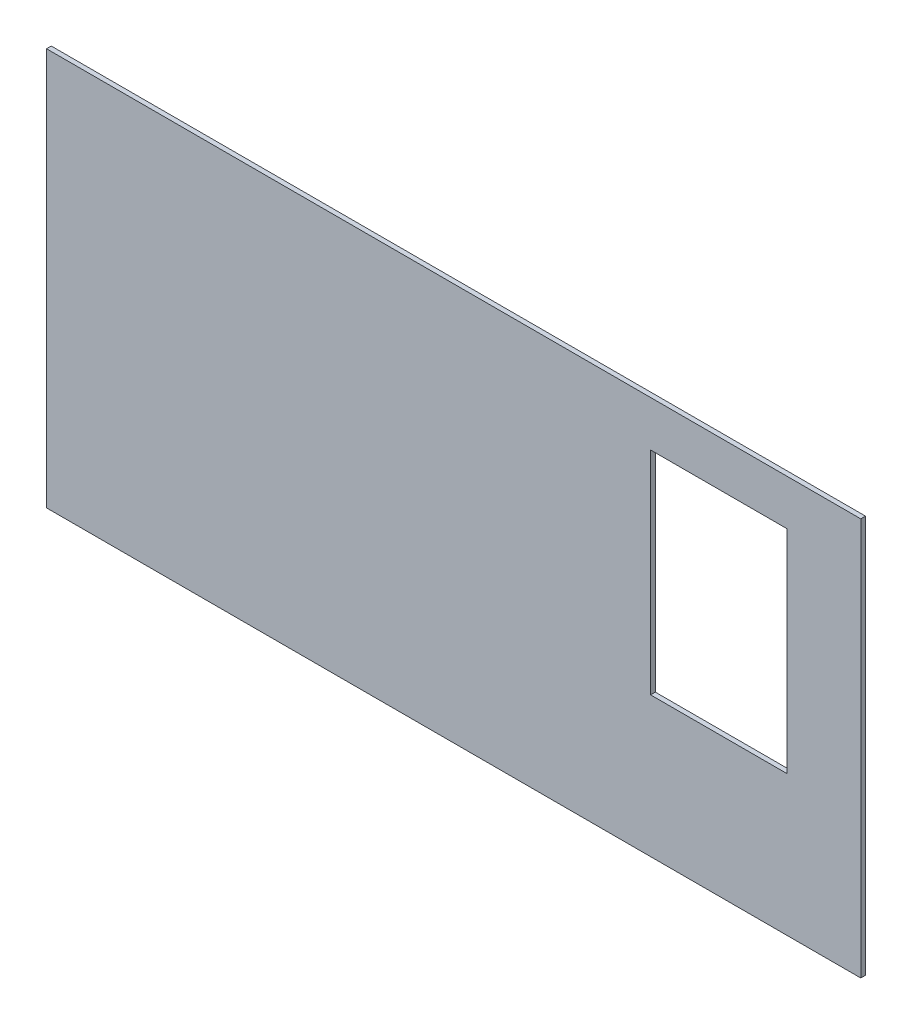
ISO-10303-21;
HEADER;
FILE_DESCRIPTION(('STEP AP214'),'2;1');
FILE_NAME('part.step','',(''),(''),'','','');
FILE_SCHEMA(('AUTOMOTIVE_DESIGN { 1 0 10303 214 1 1 1 1 }'));
ENDSEC;
DATA;
#1=APPLICATION_CONTEXT('core data for automotive mechanical design processes');
#2=APPLICATION_PROTOCOL_DEFINITION('international standard','automotive_design',2000,#1);
#3=PRODUCT_CONTEXT('',#1,'mechanical');
#4=PRODUCT('Part','Part','',(#3));
#5=PRODUCT_RELATED_PRODUCT_CATEGORY('part','',(#4));
#6=PRODUCT_DEFINITION_FORMATION('','',#4);
#7=PRODUCT_DEFINITION_CONTEXT('part definition',#1,'design');
#8=PRODUCT_DEFINITION('design','',#6,#7);
#9=PRODUCT_DEFINITION_SHAPE('','',#8);
#10=(LENGTH_UNIT() NAMED_UNIT(*) SI_UNIT(.MILLI.,.METRE.));
#11=(NAMED_UNIT(*) PLANE_ANGLE_UNIT() SI_UNIT($,.RADIAN.));
#12=(NAMED_UNIT(*) SI_UNIT($,.STERADIAN.) SOLID_ANGLE_UNIT());
#13=UNCERTAINTY_MEASURE_WITH_UNIT(LENGTH_MEASURE(1.E-05),#10,'distance_accuracy_value','');
#14=(GEOMETRIC_REPRESENTATION_CONTEXT(3) GLOBAL_UNCERTAINTY_ASSIGNED_CONTEXT((#13)) GLOBAL_UNIT_ASSIGNED_CONTEXT((#10,
#11,#12)) REPRESENTATION_CONTEXT('',''));
#15=CARTESIAN_POINT('',(0.,0.,0.));
#16=DIRECTION('',(0.,0.,1.));
#17=DIRECTION('',(1.,0.,0.));
#18=AXIS2_PLACEMENT_3D('',#15,#16,#17);
#19=CARTESIAN_POINT('',(208.,-62.,-5.1));
#20=DIRECTION('',(1.,0.,0.));
#21=DIRECTION('',(0.,1.,0.));
#22=AXIS2_PLACEMENT_3D('',#19,#20,#21);
#23=PLANE('',#22);
#24=DIRECTION('',(0.,0.,1.));
#25=VECTOR('',#24,1.);
#26=CARTESIAN_POINT('',(208.,-62.,-5.1));
#27=LINE('',#26,#25);
#28=CARTESIAN_POINT('',(208.,-62.,-5.));
#29=VERTEX_POINT('',#28);
#30=CARTESIAN_POINT('',(208.,-62.,0.));
#31=VERTEX_POINT('',#30);
#32=EDGE_CURVE('E40',#29,#31,#27,.T.);
#33=ORIENTED_EDGE('',*,*,#32,.F.);
#34=DIRECTION('',(0.,1.,0.));
#35=VECTOR('',#34,1.);
#36=CARTESIAN_POINT('',(208.,-136.,-5.));
#37=LINE('',#36,#35);
#38=CARTESIAN_POINT('',(208.,162.,-5.));
#39=VERTEX_POINT('',#38);
#40=EDGE_CURVE('E95',#29,#39,#37,.T.);
#41=ORIENTED_EDGE('',*,*,#40,.T.);
#42=DIRECTION('',(0.,0.,1.));
#43=VECTOR('',#42,1.);
#44=CARTESIAN_POINT('',(208.,162.,-5.1));
#45=LINE('',#44,#43);
#46=CARTESIAN_POINT('',(208.,162.,0.));
#47=VERTEX_POINT('',#46);
#48=EDGE_CURVE('E9',#39,#47,#45,.T.);
#49=ORIENTED_EDGE('',*,*,#48,.T.);
#50=DIRECTION('',(0.,1.,0.));
#51=VECTOR('',#50,1.);
#52=CARTESIAN_POINT('',(208.,-136.,0.));
#53=LINE('',#52,#51);
#54=EDGE_CURVE('E110',#31,#47,#53,.T.);
#55=ORIENTED_EDGE('',*,*,#54,.F.);
#56=EDGE_LOOP('',(#33,#41,#49,#55));
#57=FACE_BOUND('',#56,.T.);
#58=ADVANCED_FACE('F15',(#57),#23,.T.);
#59=CARTESIAN_POINT('',(208.,162.,-5.1));
#60=DIRECTION('',(0.,1.,0.));
#61=DIRECTION('',(1.,0.,0.));
#62=AXIS2_PLACEMENT_3D('',#59,#60,#61);
#63=PLANE('',#62);
#64=DIRECTION('',(-1.,0.,0.));
#65=VECTOR('',#64,1.);
#66=CARTESIAN_POINT('',(-111.,162.,0.));
#67=LINE('',#66,#65);
#68=CARTESIAN_POINT('',(352.,162.,0.));
#69=VERTEX_POINT('',#68);
#70=EDGE_CURVE('E150',#69,#47,#67,.T.);
#71=ORIENTED_EDGE('',*,*,#70,.T.);
#72=ORIENTED_EDGE('',*,*,#48,.F.);
#73=DIRECTION('',(-1.,0.,0.));
#74=VECTOR('',#73,1.);
#75=CARTESIAN_POINT('',(-111.,162.,-5.));
#76=LINE('',#75,#74);
#77=CARTESIAN_POINT('',(352.,162.,-5.));
#78=VERTEX_POINT('',#77);
#79=EDGE_CURVE('E87',#78,#39,#76,.T.);
#80=ORIENTED_EDGE('',*,*,#79,.F.);
#81=DIRECTION('',(0.,0.,1.));
#82=VECTOR('',#81,1.);
#83=CARTESIAN_POINT('',(352.,162.,-5.1));
#84=LINE('',#83,#82);
#85=EDGE_CURVE('E18',#78,#69,#84,.T.);
#86=ORIENTED_EDGE('',*,*,#85,.T.);
#87=EDGE_LOOP('',(#71,#72,#80,#86));
#88=FACE_BOUND('',#87,.T.);
#89=ADVANCED_FACE('F86',(#88),#63,.F.);
#90=CARTESIAN_POINT('',(352.,-62.,-5.1));
#91=DIRECTION('',(1.,0.,0.));
#92=DIRECTION('',(0.,1.,0.));
#93=AXIS2_PLACEMENT_3D('',#90,#91,#92);
#94=PLANE('',#93);
#95=DIRECTION('',(0.,1.,0.));
#96=VECTOR('',#95,1.);
#97=CARTESIAN_POINT('',(352.,-136.,0.));
#98=LINE('',#97,#96);
#99=CARTESIAN_POINT('',(352.,-62.,0.));
#100=VERTEX_POINT('',#99);
#101=EDGE_CURVE('E81',#100,#69,#98,.T.);
#102=ORIENTED_EDGE('',*,*,#101,.T.);
#103=ORIENTED_EDGE('',*,*,#85,.F.);
#104=DIRECTION('',(0.,1.,0.));
#105=VECTOR('',#104,1.);
#106=CARTESIAN_POINT('',(352.,-136.,-5.));
#107=LINE('',#106,#105);
#108=CARTESIAN_POINT('',(352.,-62.,-5.));
#109=VERTEX_POINT('',#108);
#110=EDGE_CURVE('E78',#109,#78,#107,.T.);
#111=ORIENTED_EDGE('',*,*,#110,.F.);
#112=DIRECTION('',(0.,0.,1.));
#113=VECTOR('',#112,1.);
#114=CARTESIAN_POINT('',(352.,-62.,-5.1));
#115=LINE('',#114,#113);
#116=EDGE_CURVE('E114',#109,#100,#115,.T.);
#117=ORIENTED_EDGE('',*,*,#116,.T.);
#118=EDGE_LOOP('',(#102,#103,#111,#117));
#119=FACE_BOUND('',#118,.T.);
#120=ADVANCED_FACE('F80',(#119),#94,.F.);
#121=CARTESIAN_POINT('',(208.,-62.,-5.1));
#122=DIRECTION('',(0.,1.,0.));
#123=DIRECTION('',(1.,0.,0.));
#124=AXIS2_PLACEMENT_3D('',#121,#122,#123);
#125=PLANE('',#124);
#126=ORIENTED_EDGE('',*,*,#116,.F.);
#127=DIRECTION('',(-1.,0.,0.));
#128=VECTOR('',#127,1.);
#129=CARTESIAN_POINT('',(-111.,-62.,-5.));
#130=LINE('',#129,#128);
#131=EDGE_CURVE('E100',#109,#29,#130,.T.);
#132=ORIENTED_EDGE('',*,*,#131,.T.);
#133=ORIENTED_EDGE('',*,*,#32,.T.);
#134=DIRECTION('',(-1.,0.,0.));
#135=VECTOR('',#134,1.);
#136=CARTESIAN_POINT('',(-111.,-62.,0.));
#137=LINE('',#136,#135);
#138=EDGE_CURVE('E164',#100,#31,#137,.T.);
#139=ORIENTED_EDGE('',*,*,#138,.F.);
#140=EDGE_LOOP('',(#126,#132,#133,#139));
#141=FACE_BOUND('',#140,.T.);
#142=ADVANCED_FACE('F227',(#141),#125,.T.);
#143=CARTESIAN_POINT('',(430.,-210.,-5.));
#144=DIRECTION('',(1.,0.,0.));
#145=DIRECTION('',(0.,1.,0.));
#146=AXIS2_PLACEMENT_3D('',#143,#144,#145);
#147=PLANE('',#146);
#148=DIRECTION('',(0.,0.,1.));
#149=VECTOR('',#148,1.);
#150=CARTESIAN_POINT('',(430.,-210.,-5.));
#151=LINE('',#150,#149);
#152=CARTESIAN_POINT('',(430.,-210.,-5.));
#153=VERTEX_POINT('',#152);
#154=CARTESIAN_POINT('',(430.,-210.,0.));
#155=VERTEX_POINT('',#154);
#156=EDGE_CURVE('E137',#153,#155,#151,.T.);
#157=ORIENTED_EDGE('',*,*,#156,.F.);
#158=DIRECTION('',(0.,1.,0.));
#159=VECTOR('',#158,1.);
#160=CARTESIAN_POINT('',(430.,-210.,-5.));
#161=LINE('',#160,#159);
#162=CARTESIAN_POINT('',(430.,210.,-5.));
#163=VERTEX_POINT('',#162);
#164=EDGE_CURVE('E97',#153,#163,#161,.T.);
#165=ORIENTED_EDGE('',*,*,#164,.T.);
#166=DIRECTION('',(0.,0.,1.));
#167=VECTOR('',#166,1.);
#168=CARTESIAN_POINT('',(430.,210.,-5.));
#169=LINE('',#168,#167);
#170=CARTESIAN_POINT('',(430.,210.,0.));
#171=VERTEX_POINT('',#170);
#172=EDGE_CURVE('E102',#163,#171,#169,.T.);
#173=ORIENTED_EDGE('',*,*,#172,.T.);
#174=DIRECTION('',(0.,1.,0.));
#175=VECTOR('',#174,1.);
#176=CARTESIAN_POINT('',(430.,-210.,0.));
#177=LINE('',#176,#175);
#178=EDGE_CURVE('E154',#155,#171,#177,.T.);
#179=ORIENTED_EDGE('',*,*,#178,.F.);
#180=EDGE_LOOP('',(#157,#165,#173,#179));
#181=FACE_BOUND('',#180,.T.);
#182=ADVANCED_FACE('F200',(#181),#147,.T.);
#183=CARTESIAN_POINT('',(-430.,-210.,-5.));
#184=DIRECTION('',(0.,0.,1.));
#185=DIRECTION('',(1.,0.,0.));
#186=AXIS2_PLACEMENT_3D('',#183,#184,#185);
#187=PLANE('',#186);
#188=ORIENTED_EDGE('',*,*,#110,.T.);
#189=ORIENTED_EDGE('',*,*,#79,.T.);
#190=ORIENTED_EDGE('',*,*,#40,.F.);
#191=ORIENTED_EDGE('',*,*,#131,.F.);
#192=EDGE_LOOP('',(#188,#189,#190,#191));
#193=FACE_BOUND('',#192,.T.);
#194=DIRECTION('',(1.,0.,0.));
#195=VECTOR('',#194,1.);
#196=CARTESIAN_POINT('',(-430.,210.,-5.));
#197=LINE('',#196,#195);
#198=CARTESIAN_POINT('',(-430.,210.,-5.));
#199=VERTEX_POINT('',#198);
#200=EDGE_CURVE('E126',#199,#163,#197,.T.);
#201=ORIENTED_EDGE('',*,*,#200,.T.);
#202=ORIENTED_EDGE('',*,*,#164,.F.);
#203=DIRECTION('',(1.,0.,0.));
#204=VECTOR('',#203,1.);
#205=CARTESIAN_POINT('',(-430.,-210.,-5.));
#206=LINE('',#205,#204);
#207=CARTESIAN_POINT('',(-430.,-210.,-5.));
#208=VERTEX_POINT('',#207);
#209=EDGE_CURVE('E151',#208,#153,#206,.T.);
#210=ORIENTED_EDGE('',*,*,#209,.F.);
#211=DIRECTION('',(0.,1.,0.));
#212=VECTOR('',#211,1.);
#213=CARTESIAN_POINT('',(-430.,-210.,-5.));
#214=LINE('',#213,#212);
#215=EDGE_CURVE('E135',#208,#199,#214,.T.);
#216=ORIENTED_EDGE('',*,*,#215,.T.);
#217=EDGE_LOOP('',(#201,#202,#210,#216));
#218=FACE_BOUND('',#217,.T.);
#219=ADVANCED_FACE('F92',(#193,#218),#187,.F.);
#220=CARTESIAN_POINT('',(-430.,210.,-5.));
#221=DIRECTION('',(0.,1.,0.));
#222=DIRECTION('',(1.,0.,0.));
#223=AXIS2_PLACEMENT_3D('',#220,#221,#222);
#224=PLANE('',#223);
#225=ORIENTED_EDGE('',*,*,#200,.F.);
#226=DIRECTION('',(0.,0.,1.));
#227=VECTOR('',#226,1.);
#228=CARTESIAN_POINT('',(-430.,210.,-5.));
#229=LINE('',#228,#227);
#230=CARTESIAN_POINT('',(-430.,210.,0.));
#231=VERTEX_POINT('',#230);
#232=EDGE_CURVE('E128',#199,#231,#229,.T.);
#233=ORIENTED_EDGE('',*,*,#232,.T.);
#234=DIRECTION('',(1.,0.,0.));
#235=VECTOR('',#234,1.);
#236=CARTESIAN_POINT('',(-430.,210.,0.));
#237=LINE('',#236,#235);
#238=EDGE_CURVE('E158',#231,#171,#237,.T.);
#239=ORIENTED_EDGE('',*,*,#238,.T.);
#240=ORIENTED_EDGE('',*,*,#172,.F.);
#241=EDGE_LOOP('',(#225,#233,#239,#240));
#242=FACE_BOUND('',#241,.T.);
#243=ADVANCED_FACE('F179',(#242),#224,.T.);
#244=CARTESIAN_POINT('',(-430.,-210.,0.));
#245=DIRECTION('',(0.,0.,1.));
#246=DIRECTION('',(1.,0.,0.));
#247=AXIS2_PLACEMENT_3D('',#244,#245,#246);
#248=PLANE('',#247);
#249=ORIENTED_EDGE('',*,*,#138,.T.);
#250=ORIENTED_EDGE('',*,*,#54,.T.);
#251=ORIENTED_EDGE('',*,*,#70,.F.);
#252=ORIENTED_EDGE('',*,*,#101,.F.);
#253=EDGE_LOOP('',(#249,#250,#251,#252));
#254=FACE_BOUND('',#253,.T.);
#255=DIRECTION('',(0.,1.,0.));
#256=VECTOR('',#255,1.);
#257=CARTESIAN_POINT('',(-430.,-210.,0.));
#258=LINE('',#257,#256);
#259=CARTESIAN_POINT('',(-430.,-210.,0.));
#260=VERTEX_POINT('',#259);
#261=EDGE_CURVE('E124',#260,#231,#258,.T.);
#262=ORIENTED_EDGE('',*,*,#261,.F.);
#263=DIRECTION('',(1.,0.,0.));
#264=VECTOR('',#263,1.);
#265=CARTESIAN_POINT('',(-430.,-210.,0.));
#266=LINE('',#265,#264);
#267=EDGE_CURVE('E145',#260,#155,#266,.T.);
#268=ORIENTED_EDGE('',*,*,#267,.T.);
#269=ORIENTED_EDGE('',*,*,#178,.T.);
#270=ORIENTED_EDGE('',*,*,#238,.F.);
#271=EDGE_LOOP('',(#262,#268,#269,#270));
#272=FACE_BOUND('',#271,.T.);
#273=ADVANCED_FACE('F201',(#254,#272),#248,.T.);
#274=CARTESIAN_POINT('',(-430.,-210.,-5.));
#275=DIRECTION('',(0.,1.,0.));
#276=DIRECTION('',(1.,0.,0.));
#277=AXIS2_PLACEMENT_3D('',#274,#275,#276);
#278=PLANE('',#277);
#279=ORIENTED_EDGE('',*,*,#156,.T.);
#280=ORIENTED_EDGE('',*,*,#267,.F.);
#281=DIRECTION('',(0.,0.,1.));
#282=VECTOR('',#281,1.);
#283=CARTESIAN_POINT('',(-430.,-210.,-5.));
#284=LINE('',#283,#282);
#285=EDGE_CURVE('E136',#208,#260,#284,.T.);
#286=ORIENTED_EDGE('',*,*,#285,.F.);
#287=ORIENTED_EDGE('',*,*,#209,.T.);
#288=EDGE_LOOP('',(#279,#280,#286,#287));
#289=FACE_BOUND('',#288,.T.);
#290=ADVANCED_FACE('F206',(#289),#278,.F.);
#291=CARTESIAN_POINT('',(-430.,-210.,-5.));
#292=DIRECTION('',(1.,0.,0.));
#293=DIRECTION('',(0.,1.,0.));
#294=AXIS2_PLACEMENT_3D('',#291,#292,#293);
#295=PLANE('',#294);
#296=ORIENTED_EDGE('',*,*,#261,.T.);
#297=ORIENTED_EDGE('',*,*,#232,.F.);
#298=ORIENTED_EDGE('',*,*,#215,.F.);
#299=ORIENTED_EDGE('',*,*,#285,.T.);
#300=EDGE_LOOP('',(#296,#297,#298,#299));
#301=FACE_BOUND('',#300,.T.);
#302=ADVANCED_FACE('F208',(#301),#295,.F.);
#303=CLOSED_SHELL('',(#58,#89,#120,#142,#182,#219,#243,#273,#290,#302));
#304=MANIFOLD_SOLID_BREP('B1',#303);
#305=ADVANCED_BREP_SHAPE_REPRESENTATION('',(#18,#304),#14);
#306=SHAPE_DEFINITION_REPRESENTATION(#9,#305);
ENDSEC;
END-ISO-10303-21;
